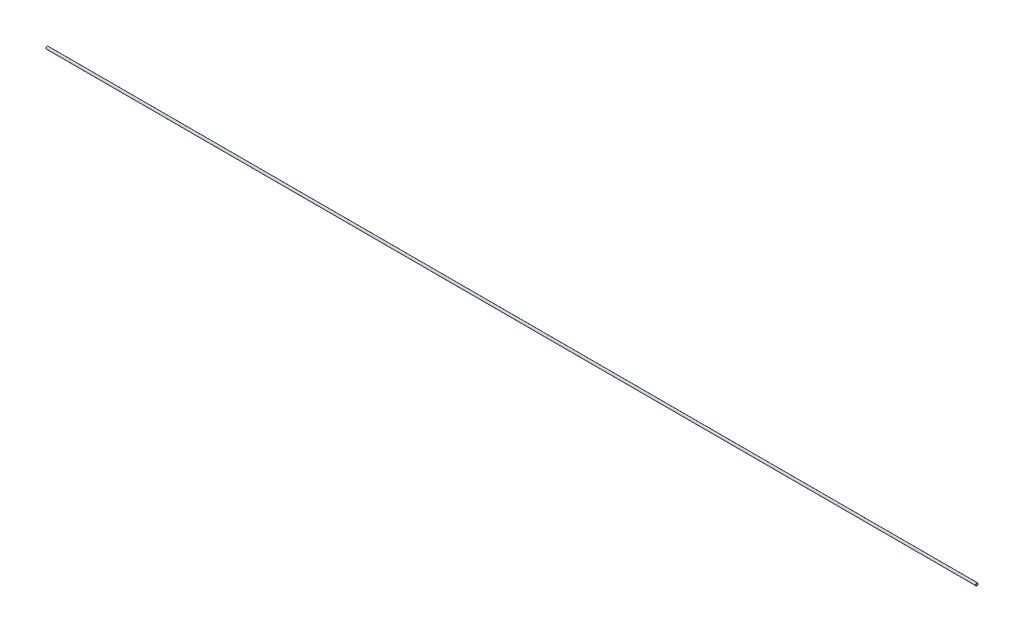
ISO-10303-21;
HEADER;
FILE_DESCRIPTION(('STEP AP214'),'2;1');
FILE_NAME('part.step','',(''),(''),'','','');
FILE_SCHEMA(('AUTOMOTIVE_DESIGN { 1 0 10303 214 1 1 1 1 }'));
ENDSEC;
DATA;
#1=APPLICATION_CONTEXT('core data for automotive mechanical design processes');
#2=APPLICATION_PROTOCOL_DEFINITION('international standard','automotive_design',2000,#1);
#3=PRODUCT_CONTEXT('',#1,'mechanical');
#4=PRODUCT('Part','Part','',(#3));
#5=PRODUCT_RELATED_PRODUCT_CATEGORY('part','',(#4));
#6=PRODUCT_DEFINITION_FORMATION('','',#4);
#7=PRODUCT_DEFINITION_CONTEXT('part definition',#1,'design');
#8=PRODUCT_DEFINITION('design','',#6,#7);
#9=PRODUCT_DEFINITION_SHAPE('','',#8);
#10=(LENGTH_UNIT() NAMED_UNIT(*) SI_UNIT(.MILLI.,.METRE.));
#11=(NAMED_UNIT(*) PLANE_ANGLE_UNIT() SI_UNIT($,.RADIAN.));
#12=(NAMED_UNIT(*) SI_UNIT($,.STERADIAN.) SOLID_ANGLE_UNIT());
#13=UNCERTAINTY_MEASURE_WITH_UNIT(LENGTH_MEASURE(1.E-05),#10,'distance_accuracy_value','');
#14=(GEOMETRIC_REPRESENTATION_CONTEXT(3) GLOBAL_UNCERTAINTY_ASSIGNED_CONTEXT((#13)) GLOBAL_UNIT_ASSIGNED_CONTEXT((#10,
#11,#12)) REPRESENTATION_CONTEXT('',''));
#15=CARTESIAN_POINT('',(0.,0.,0.));
#16=DIRECTION('',(0.,0.,1.));
#17=DIRECTION('',(1.,0.,0.));
#18=AXIS2_PLACEMENT_3D('',#15,#16,#17);
#19=CARTESIAN_POINT('',(300.400000000005,0.,0.));
#20=DIRECTION('',(-1.,0.,0.));
#21=DIRECTION('',(0.,0.,1.));
#22=AXIS2_PLACEMENT_3D('',#19,#20,#21);
#23=CYLINDRICAL_SURFACE('',#22,0.79375);
#24=CARTESIAN_POINT('',(-300.241250000005,0.,0.));
#25=DIRECTION('',(1.,0.,0.));
#26=DIRECTION('',(0.,0.,-1.));
#27=AXIS2_PLACEMENT_3D('',#24,#25,#26);
#28=CIRCLE('',#27,0.79375);
#29=CARTESIAN_POINT('',(-300.241250000005,0.,-0.79375));
#30=VERTEX_POINT('',#29);
#31=EDGE_CURVE('E58',#30,#30,#28,.T.);
#32=ORIENTED_EDGE('',*,*,#31,.T.);
#33=EDGE_LOOP('',(#32));
#34=FACE_BOUND('',#33,.T.);
#35=CARTESIAN_POINT('',(300.241250000005,0.,0.));
#36=DIRECTION('',(1.,0.,0.));
#37=DIRECTION('',(0.,0.,-1.));
#38=AXIS2_PLACEMENT_3D('',#35,#36,#37);
#39=CIRCLE('',#38,0.79375);
#40=CARTESIAN_POINT('',(300.241250000005,0.,-0.79375));
#41=VERTEX_POINT('',#40);
#42=EDGE_CURVE('E63',#41,#41,#39,.F.);
#43=ORIENTED_EDGE('',*,*,#42,.T.);
#44=EDGE_LOOP('',(#43));
#45=FACE_BOUND('',#44,.T.);
#46=ADVANCED_FACE('F45',(#34,#45),#23,.T.);
#47=CARTESIAN_POINT('',(300.400000000005,0.,0.));
#48=DIRECTION('',(1.,0.,0.));
#49=DIRECTION('',(0.,0.,-1.));
#50=AXIS2_PLACEMENT_3D('',#47,#48,#49);
#51=PLANE('',#50);
#52=CARTESIAN_POINT('',(300.400000000005,0.,0.));
#53=DIRECTION('',(1.,0.,0.));
#54=DIRECTION('',(0.,0.,-1.));
#55=AXIS2_PLACEMENT_3D('',#52,#53,#54);
#56=CIRCLE('',#55,0.634999999999997);
#57=CARTESIAN_POINT('',(300.400000000005,0.,-0.634999999999997));
#58=VERTEX_POINT('',#57);
#59=EDGE_CURVE('E10',#58,#58,#56,.T.);
#60=ORIENTED_EDGE('',*,*,#59,.T.);
#61=EDGE_LOOP('',(#60));
#62=FACE_BOUND('',#61,.T.);
#63=ADVANCED_FACE('F80',(#62),#51,.T.);
#64=CARTESIAN_POINT('',(-300.400000000005,0.,0.));
#65=DIRECTION('',(1.,0.,0.));
#66=DIRECTION('',(0.,0.,-1.));
#67=AXIS2_PLACEMENT_3D('',#64,#65,#66);
#68=PLANE('',#67);
#69=CARTESIAN_POINT('',(-300.400000000005,0.,0.));
#70=DIRECTION('',(1.,0.,0.));
#71=DIRECTION('',(0.,0.,-1.));
#72=AXIS2_PLACEMENT_3D('',#69,#70,#71);
#73=CIRCLE('',#72,0.635000000000108);
#74=CARTESIAN_POINT('',(-300.400000000005,0.,-0.635000000000108));
#75=VERTEX_POINT('',#74);
#76=EDGE_CURVE('E53',#75,#75,#73,.F.);
#77=ORIENTED_EDGE('',*,*,#76,.T.);
#78=EDGE_LOOP('',(#77));
#79=FACE_BOUND('',#78,.T.);
#80=ADVANCED_FACE('F77',(#79),#68,.F.);
#81=CARTESIAN_POINT('',(-300.241250000005,0.,0.));
#82=DIRECTION('',(1.,0.,0.));
#83=DIRECTION('',(0.,0.,-1.));
#84=AXIS2_PLACEMENT_3D('',#81,#82,#83);
#85=CONICAL_SURFACE('',#84,0.79375,0.785398163397505);
#86=ORIENTED_EDGE('',*,*,#76,.F.);
#87=EDGE_LOOP('',(#86));
#88=FACE_BOUND('',#87,.T.);
#89=ORIENTED_EDGE('',*,*,#31,.F.);
#90=EDGE_LOOP('',(#89));
#91=FACE_BOUND('',#90,.T.);
#92=ADVANCED_FACE('F73',(#88,#91),#85,.T.);
#93=CARTESIAN_POINT('',(300.400000000005,0.,0.));
#94=DIRECTION('',(-1.,0.,0.));
#95=DIRECTION('',(0.,0.,1.));
#96=AXIS2_PLACEMENT_3D('',#93,#94,#95);
#97=CONICAL_SURFACE('',#96,0.634999999999997,0.78539816339768);
#98=ORIENTED_EDGE('',*,*,#42,.F.);
#99=EDGE_LOOP('',(#98));
#100=FACE_BOUND('',#99,.T.);
#101=ORIENTED_EDGE('',*,*,#59,.F.);
#102=EDGE_LOOP('',(#101));
#103=FACE_BOUND('',#102,.T.);
#104=ADVANCED_FACE('F47',(#100,#103),#97,.T.);
#105=CLOSED_SHELL('',(#46,#63,#80,#92,#104));
#106=MANIFOLD_SOLID_BREP('B2',#105);
#107=ADVANCED_BREP_SHAPE_REPRESENTATION('',(#18,#106),#14);
#108=SHAPE_DEFINITION_REPRESENTATION(#9,#107);
ENDSEC;
END-ISO-10303-21;
